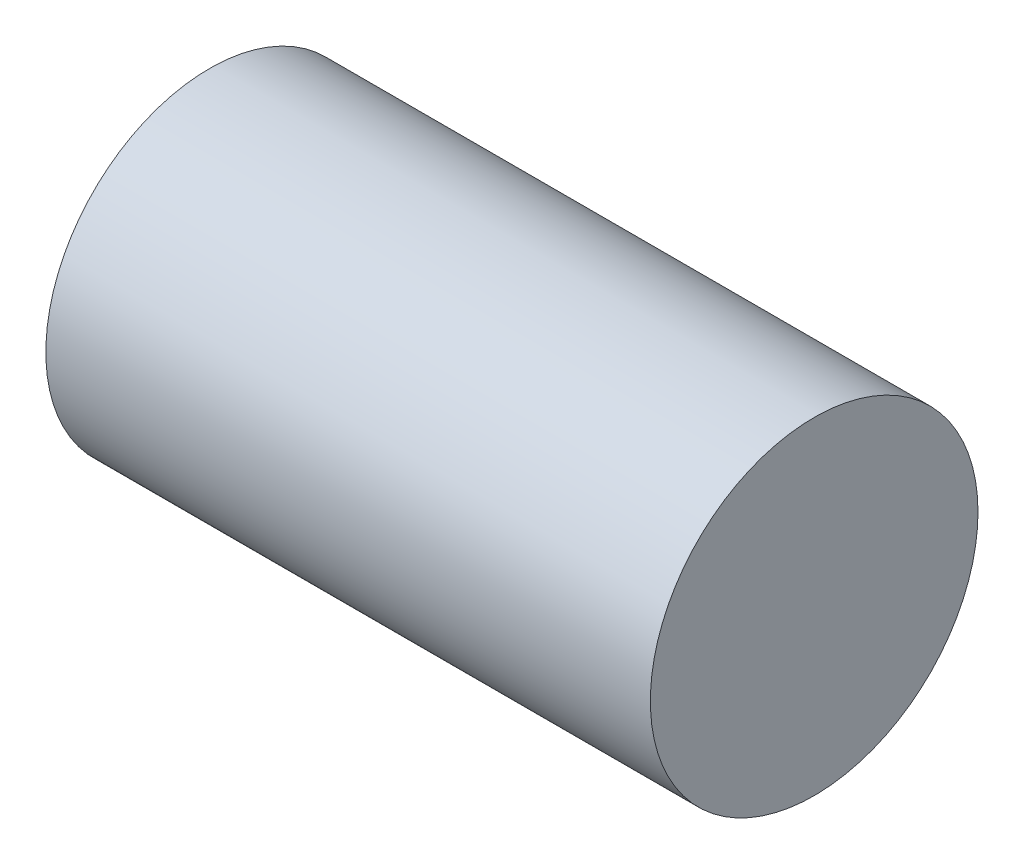
ISO-10303-21;
HEADER;
FILE_DESCRIPTION(('STEP AP214'),'2;1');
FILE_NAME('part.step','',(''),(''),'','','');
FILE_SCHEMA(('AUTOMOTIVE_DESIGN { 1 0 10303 214 1 1 1 1 }'));
ENDSEC;
DATA;
#1=APPLICATION_CONTEXT('core data for automotive mechanical design processes');
#2=APPLICATION_PROTOCOL_DEFINITION('international standard','automotive_design',2000,#1);
#3=PRODUCT_CONTEXT('',#1,'mechanical');
#4=PRODUCT('Part','Part','',(#3));
#5=PRODUCT_RELATED_PRODUCT_CATEGORY('part','',(#4));
#6=PRODUCT_DEFINITION_FORMATION('','',#4);
#7=PRODUCT_DEFINITION_CONTEXT('part definition',#1,'design');
#8=PRODUCT_DEFINITION('design','',#6,#7);
#9=PRODUCT_DEFINITION_SHAPE('','',#8);
#10=(LENGTH_UNIT() NAMED_UNIT(*) SI_UNIT(.MILLI.,.METRE.));
#11=(NAMED_UNIT(*) PLANE_ANGLE_UNIT() SI_UNIT($,.RADIAN.));
#12=(NAMED_UNIT(*) SI_UNIT($,.STERADIAN.) SOLID_ANGLE_UNIT());
#13=UNCERTAINTY_MEASURE_WITH_UNIT(LENGTH_MEASURE(1.E-05),#10,'distance_accuracy_value','');
#14=(GEOMETRIC_REPRESENTATION_CONTEXT(3) GLOBAL_UNCERTAINTY_ASSIGNED_CONTEXT((#13)) GLOBAL_UNIT_ASSIGNED_CONTEXT((#10,
#11,#12)) REPRESENTATION_CONTEXT('',''));
#15=CARTESIAN_POINT('',(0.,0.,0.));
#16=DIRECTION('',(0.,0.,1.));
#17=DIRECTION('',(1.,0.,0.));
#18=AXIS2_PLACEMENT_3D('',#15,#16,#17);
#19=CARTESIAN_POINT('',(14.65,0.,0.));
#20=DIRECTION('',(-1.,0.,0.));
#21=DIRECTION('',(0.,0.,1.));
#22=AXIS2_PLACEMENT_3D('',#19,#20,#21);
#23=CYLINDRICAL_SURFACE('',#22,3.97);
#24=CARTESIAN_POINT('',(14.65,0.,0.));
#25=DIRECTION('',(1.,0.,0.));
#26=DIRECTION('',(0.,0.,-1.));
#27=AXIS2_PLACEMENT_3D('',#24,#25,#26);
#28=CIRCLE('',#27,3.97);
#29=CARTESIAN_POINT('',(14.65,0.,-3.97));
#30=VERTEX_POINT('',#29);
#31=EDGE_CURVE('E10',#30,#30,#28,.T.);
#32=ORIENTED_EDGE('',*,*,#31,.F.);
#33=EDGE_LOOP('',(#32));
#34=FACE_BOUND('',#33,.T.);
#35=CARTESIAN_POINT('',(0.,0.,0.));
#36=DIRECTION('',(1.,0.,0.));
#37=DIRECTION('',(0.,0.,-1.));
#38=AXIS2_PLACEMENT_3D('',#35,#36,#37);
#39=CIRCLE('',#38,3.97);
#40=CARTESIAN_POINT('',(0.,0.,-3.97));
#41=VERTEX_POINT('',#40);
#42=EDGE_CURVE('E48',#41,#41,#39,.T.);
#43=ORIENTED_EDGE('',*,*,#42,.T.);
#44=EDGE_LOOP('',(#43));
#45=FACE_BOUND('',#44,.T.);
#46=ADVANCED_FACE('F45',(#34,#45),#23,.T.);
#47=CARTESIAN_POINT('',(14.65,0.,0.));
#48=DIRECTION('',(1.,0.,0.));
#49=DIRECTION('',(0.,0.,-1.));
#50=AXIS2_PLACEMENT_3D('',#47,#48,#49);
#51=PLANE('',#50);
#52=ORIENTED_EDGE('',*,*,#31,.T.);
#53=EDGE_LOOP('',(#52));
#54=FACE_BOUND('',#53,.T.);
#55=ADVANCED_FACE('F62',(#54),#51,.T.);
#56=CARTESIAN_POINT('',(0.,0.,0.));
#57=DIRECTION('',(1.,0.,0.));
#58=DIRECTION('',(0.,0.,-1.));
#59=AXIS2_PLACEMENT_3D('',#56,#57,#58);
#60=PLANE('',#59);
#61=ORIENTED_EDGE('',*,*,#42,.F.);
#62=EDGE_LOOP('',(#61));
#63=FACE_BOUND('',#62,.T.);
#64=ADVANCED_FACE('F60',(#63),#60,.F.);
#65=CLOSED_SHELL('',(#46,#55,#64));
#66=MANIFOLD_SOLID_BREP('B2',#65);
#67=ADVANCED_BREP_SHAPE_REPRESENTATION('',(#18,#66),#14);
#68=SHAPE_DEFINITION_REPRESENTATION(#9,#67);
ENDSEC;
END-ISO-10303-21;
